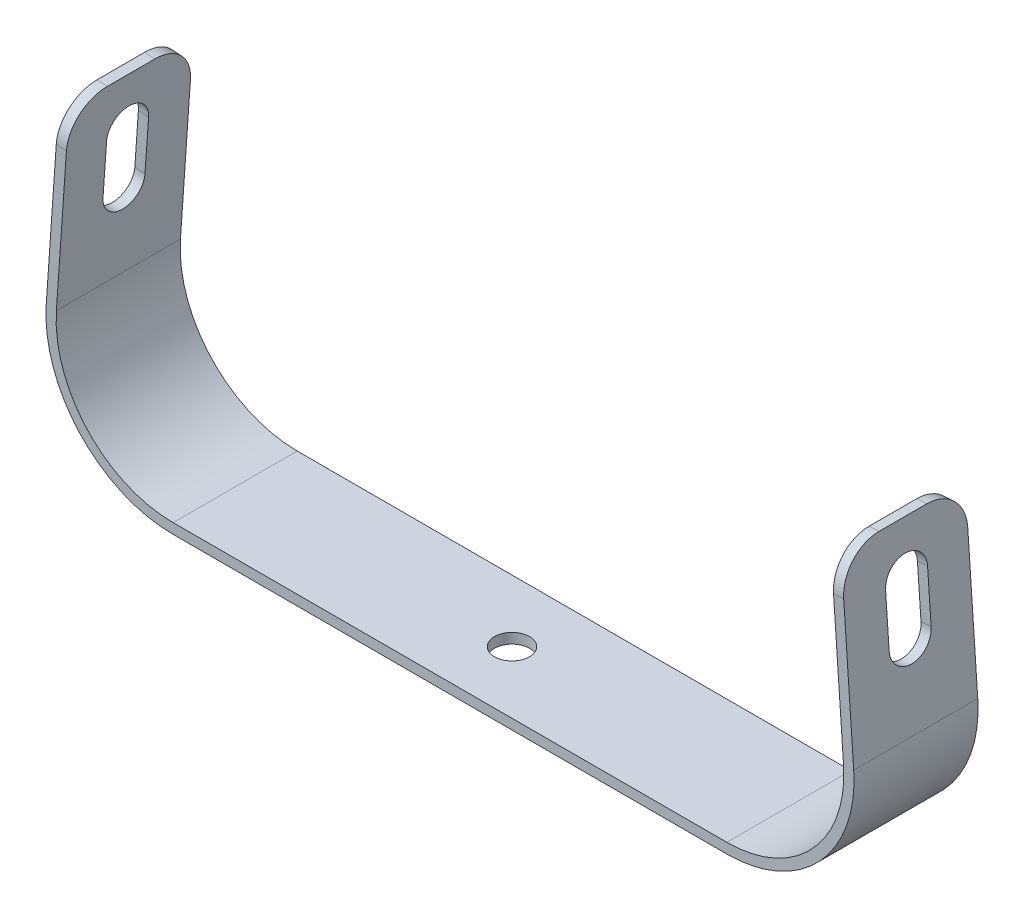
ISO-10303-21;
HEADER;
FILE_DESCRIPTION(('STEP AP214'),'2;1');
FILE_NAME('part.step','',(''),(''),'','','');
FILE_SCHEMA(('AUTOMOTIVE_DESIGN { 1 0 10303 214 1 1 1 1 }'));
ENDSEC;
DATA;
#1=APPLICATION_CONTEXT('core data for automotive mechanical design processes');
#2=APPLICATION_PROTOCOL_DEFINITION('international standard','automotive_design',2000,#1);
#3=PRODUCT_CONTEXT('',#1,'mechanical');
#4=PRODUCT('Part','Part','',(#3));
#5=PRODUCT_RELATED_PRODUCT_CATEGORY('part','',(#4));
#6=PRODUCT_DEFINITION_FORMATION('','',#4);
#7=PRODUCT_DEFINITION_CONTEXT('part definition',#1,'design');
#8=PRODUCT_DEFINITION('design','',#6,#7);
#9=PRODUCT_DEFINITION_SHAPE('','',#8);
#10=(LENGTH_UNIT() NAMED_UNIT(*) SI_UNIT(.MILLI.,.METRE.));
#11=(NAMED_UNIT(*) PLANE_ANGLE_UNIT() SI_UNIT($,.RADIAN.));
#12=(NAMED_UNIT(*) SI_UNIT($,.STERADIAN.) SOLID_ANGLE_UNIT());
#13=UNCERTAINTY_MEASURE_WITH_UNIT(LENGTH_MEASURE(1.E-05),#10,'distance_accuracy_value','');
#14=(GEOMETRIC_REPRESENTATION_CONTEXT(3) GLOBAL_UNCERTAINTY_ASSIGNED_CONTEXT((#13)) GLOBAL_UNIT_ASSIGNED_CONTEXT((#10,
#11,#12)) REPRESENTATION_CONTEXT('',''));
#15=CARTESIAN_POINT('',(0.,0.,0.));
#16=DIRECTION('',(0.,0.,1.));
#17=DIRECTION('',(1.,0.,0.));
#18=AXIS2_PLACEMENT_3D('',#15,#16,#17);
#19=CARTESIAN_POINT('',(452.110985161686,-170.979477552014,-494.449999926082));
#20=DIRECTION('',(0.997564050259824,-0.0697564737441253,0.));
#21=DIRECTION('',(0.0697564737441253,0.997564050259824,0.));
#22=AXIS2_PLACEMENT_3D('',#19,#20,#21);
#23=CYLINDRICAL_SURFACE('',#22,6.);
#24=DIRECTION('',(0.997564050259824,-0.0697564737441253,0.));
#25=VECTOR('',#24,1.);
#26=CARTESIAN_POINT('',(452.110985161686,-170.979477552014,-488.449999926082));
#27=LINE('',#26,#25);
#28=CARTESIAN_POINT('',(414.620123332679,-168.357861107297,-488.449999926082));
#29=VERTEX_POINT('',#28);
#30=CARTESIAN_POINT('',(416.216225813094,-168.469471465288,-488.449999926082));
#31=VERTEX_POINT('',#30);
#32=EDGE_CURVE('E234',#29,#31,#27,.T.);
#33=ORIENTED_EDGE('',*,*,#32,.T.);
#34=CARTESIAN_POINT('',(416.216225813094,-168.469471465287,-494.449999926082));
#35=DIRECTION('',(0.997564050259824,-0.0697564737441253,0.));
#36=DIRECTION('',(0.0697564737441253,0.997564050259824,0.));
#37=AXIS2_PLACEMENT_3D('',#34,#35,#36);
#38=CIRCLE('',#37,6.);
#39=CARTESIAN_POINT('',(416.634764655559,-162.484087163729,-494.449999926082));
#40=VERTEX_POINT('',#39);
#41=EDGE_CURVE('E317',#31,#40,#38,.F.);
#42=ORIENTED_EDGE('',*,*,#41,.T.);
#43=DIRECTION('',(-0.997564050259824,0.0697564737441253,0.));
#44=VECTOR('',#43,1.);
#45=CARTESIAN_POINT('',(416.634764655559,-162.484087163729,-494.449999926082));
#46=LINE('',#45,#44);
#47=CARTESIAN_POINT('',(415.038662175143,-162.372476805738,-494.449999926082));
#48=VERTEX_POINT('',#47);
#49=EDGE_CURVE('E229',#48,#40,#46,.F.);
#50=ORIENTED_EDGE('',*,*,#49,.F.);
#51=CARTESIAN_POINT('',(414.620123332678,-168.357861107297,-494.449999926082));
#52=DIRECTION('',(0.997564050259824,-0.0697564737441253,0.));
#53=DIRECTION('',(0.0697564737441253,0.997564050259824,0.));
#54=AXIS2_PLACEMENT_3D('',#51,#52,#53);
#55=CIRCLE('',#54,6.);
#56=EDGE_CURVE('E302',#29,#48,#55,.F.);
#57=ORIENTED_EDGE('',*,*,#56,.F.);
#58=EDGE_LOOP('',(#33,#42,#50,#57));
#59=FACE_BOUND('',#58,.T.);
#60=ADVANCED_FACE('F17',(#59),#23,.T.);
#61=CARTESIAN_POINT('',(416.634764655559,-162.484087163729,-510.95));
#62=DIRECTION('',(0.0697564737441253,0.997564050259824,0.));
#63=DIRECTION('',(-0.997564050259824,0.0697564737441253,0.));
#64=AXIS2_PLACEMENT_3D('',#61,#62,#63);
#65=PLANE('',#64);
#66=DIRECTION('',(0.997564050259824,-0.0697564737441253,0.));
#67=VECTOR('',#66,1.);
#68=CARTESIAN_POINT('',(452.529524004151,-164.994093250455,-501.95));
#69=LINE('',#68,#67);
#70=CARTESIAN_POINT('',(415.038662175144,-162.372476805738,-501.95));
#71=VERTEX_POINT('',#70);
#72=CARTESIAN_POINT('',(416.634764655559,-162.484087163729,-501.95));
#73=VERTEX_POINT('',#72);
#74=EDGE_CURVE('E226',#71,#73,#69,.T.);
#75=ORIENTED_EDGE('',*,*,#74,.F.);
#76=DIRECTION('',(0.,0.,1.));
#77=VECTOR('',#76,1.);
#78=CARTESIAN_POINT('',(415.038662175144,-162.372476805738,-133.95));
#79=LINE('',#78,#77);
#80=EDGE_CURVE('E301',#48,#71,#79,.F.);
#81=ORIENTED_EDGE('',*,*,#80,.F.);
#82=ORIENTED_EDGE('',*,*,#49,.T.);
#83=DIRECTION('',(0.,0.,1.));
#84=VECTOR('',#83,1.);
#85=CARTESIAN_POINT('',(416.634764655559,-162.484087163729,-133.95));
#86=LINE('',#85,#84);
#87=EDGE_CURVE('E316',#40,#73,#86,.F.);
#88=ORIENTED_EDGE('',*,*,#87,.T.);
#89=EDGE_LOOP('',(#75,#81,#82,#88));
#90=FACE_BOUND('',#89,.T.);
#91=ADVANCED_FACE('F441',(#90),#65,.T.);
#92=CARTESIAN_POINT('',(452.110985161686,-170.979477552014,-501.95));
#93=DIRECTION('',(0.997564050259824,-0.0697564737441253,0.));
#94=DIRECTION('',(0.0697564737441253,0.997564050259824,0.));
#95=AXIS2_PLACEMENT_3D('',#92,#93,#94);
#96=CYLINDRICAL_SURFACE('',#95,6.);
#97=ORIENTED_EDGE('',*,*,#74,.T.);
#98=CARTESIAN_POINT('',(416.216225813094,-168.469471465287,-501.95));
#99=DIRECTION('',(0.997564050259824,-0.0697564737441253,0.));
#100=DIRECTION('',(0.0697564737441253,0.997564050259824,0.));
#101=AXIS2_PLACEMENT_3D('',#98,#99,#100);
#102=CIRCLE('',#101,6.);
#103=CARTESIAN_POINT('',(416.216225813094,-168.469471465288,-507.95));
#104=VERTEX_POINT('',#103);
#105=EDGE_CURVE('E313',#73,#104,#102,.F.);
#106=ORIENTED_EDGE('',*,*,#105,.T.);
#107=DIRECTION('',(0.997564050259824,-0.0697564737441253,0.));
#108=VECTOR('',#107,1.);
#109=CARTESIAN_POINT('',(452.110985161686,-170.979477552015,-507.95));
#110=LINE('',#109,#108);
#111=CARTESIAN_POINT('',(414.620123332679,-168.357861107297,-507.95));
#112=VERTEX_POINT('',#111);
#113=EDGE_CURVE('E227',#104,#112,#110,.F.);
#114=ORIENTED_EDGE('',*,*,#113,.T.);
#115=CARTESIAN_POINT('',(414.620123332679,-168.357861107297,-501.95));
#116=DIRECTION('',(0.997564050259824,-0.0697564737441253,0.));
#117=DIRECTION('',(0.0697564737441253,0.997564050259824,0.));
#118=AXIS2_PLACEMENT_3D('',#115,#116,#117);
#119=CIRCLE('',#118,6.);
#120=EDGE_CURVE('E298',#71,#112,#119,.F.);
#121=ORIENTED_EDGE('',*,*,#120,.F.);
#122=EDGE_LOOP('',(#97,#106,#114,#121));
#123=FACE_BOUND('',#122,.T.);
#124=ADVANCED_FACE('F438',(#123),#96,.T.);
#125=CARTESIAN_POINT('',(413.922558595237,-178.333501609896,-501.499999963041));
#126=DIRECTION('',(0.,0.,1.));
#127=DIRECTION('',(0.,-1.,0.));
#128=AXIS2_PLACEMENT_3D('',#125,#126,#127);
#129=PLANE('',#128);
#130=DIRECTION('',(-0.0697564737441253,-0.997564050259824,0.));
#131=VECTOR('',#130,1.);
#132=CARTESIAN_POINT('',(411.375149748335,-237.700084590764,-501.499999963041));
#133=LINE('',#132,#131);
#134=CARTESIAN_POINT('',(415.518661075653,-178.445111967887,-501.499999963041));
#135=VERTEX_POINT('',#134);
#136=CARTESIAN_POINT('',(416.076712865606,-170.464599565808,-501.499999963041));
#137=VERTEX_POINT('',#136);
#138=EDGE_CURVE('E305',#135,#137,#133,.F.);
#139=ORIENTED_EDGE('',*,*,#138,.T.);
#140=DIRECTION('',(-0.997564050259824,0.0697564737441253,0.));
#141=VECTOR('',#140,1.);
#142=CARTESIAN_POINT('',(414.480610385191,-170.352989207817,-501.499999963041));
#143=LINE('',#142,#141);
#144=CARTESIAN_POINT('',(414.48061038519,-170.352989207817,-501.499999963041));
#145=VERTEX_POINT('',#144);
#146=EDGE_CURVE('E224',#137,#145,#143,.T.);
#147=ORIENTED_EDGE('',*,*,#146,.T.);
#148=DIRECTION('',(-0.0697564737441253,-0.997564050259824,0.));
#149=VECTOR('',#148,1.);
#150=CARTESIAN_POINT('',(409.77904726792,-237.588474232773,-501.499999963041));
#151=LINE('',#150,#149);
#152=CARTESIAN_POINT('',(413.922558595237,-178.333501609896,-501.499999963041));
#153=VERTEX_POINT('',#152);
#154=EDGE_CURVE('E297',#153,#145,#151,.F.);
#155=ORIENTED_EDGE('',*,*,#154,.F.);
#156=DIRECTION('',(-0.997564050259824,0.0697564737441253,0.));
#157=VECTOR('',#156,1.);
#158=CARTESIAN_POINT('',(413.922558595237,-178.333501609896,-501.499999963041));
#159=LINE('',#158,#157);
#160=EDGE_CURVE('E219',#153,#135,#159,.F.);
#161=ORIENTED_EDGE('',*,*,#160,.T.);
#162=EDGE_LOOP('',(#139,#147,#155,#161));
#163=FACE_BOUND('',#162,.T.);
#164=ADVANCED_FACE('F508',(#163),#129,.T.);
#165=CARTESIAN_POINT('',(414.480610385191,-170.352989207817,-498.199999963041));
#166=DIRECTION('',(-0.997564050259824,0.0697564737441253,0.));
#167=DIRECTION('',(-0.0697564737441253,-0.997564050259824,0.));
#168=AXIS2_PLACEMENT_3D('',#165,#166,#167);
#169=CYLINDRICAL_SURFACE('',#168,3.3);
#170=ORIENTED_EDGE('',*,*,#146,.F.);
#171=CARTESIAN_POINT('',(416.076712865606,-170.464599565808,-498.199999963041));
#172=DIRECTION('',(-0.997564050259824,0.0697564737441253,0.));
#173=DIRECTION('',(-0.0697564737441253,-0.997564050259824,0.));
#174=AXIS2_PLACEMENT_3D('',#171,#172,#173);
#175=CIRCLE('',#174,3.3);
#176=CARTESIAN_POINT('',(416.076712865606,-170.464599565808,-494.899999963041));
#177=VERTEX_POINT('',#176);
#178=EDGE_CURVE('E310',#137,#177,#175,.F.);
#179=ORIENTED_EDGE('',*,*,#178,.T.);
#180=DIRECTION('',(0.997564050259809,-0.0697564737443516,0.));
#181=VECTOR('',#180,1.);
#182=CARTESIAN_POINT('',(414.48061038519,-170.352989207817,-494.899999963041));
#183=LINE('',#182,#181);
#184=CARTESIAN_POINT('',(414.48061038519,-170.352989207817,-494.899999963041));
#185=VERTEX_POINT('',#184);
#186=EDGE_CURVE('E221',#185,#177,#183,.T.);
#187=ORIENTED_EDGE('',*,*,#186,.F.);
#188=CARTESIAN_POINT('',(414.48061038519,-170.352989207817,-498.199999963041));
#189=DIRECTION('',(-0.997564050259824,0.0697564737441253,0.));
#190=DIRECTION('',(-0.0697564737441253,-0.997564050259824,0.));
#191=AXIS2_PLACEMENT_3D('',#188,#189,#190);
#192=CIRCLE('',#191,3.3);
#193=EDGE_CURVE('E294',#145,#185,#192,.F.);
#194=ORIENTED_EDGE('',*,*,#193,.F.);
#195=EDGE_LOOP('',(#170,#179,#187,#194));
#196=FACE_BOUND('',#195,.T.);
#197=ADVANCED_FACE('F504',(#196),#169,.F.);
#198=CARTESIAN_POINT('',(414.480610385191,-170.352989207817,-494.899999963041));
#199=DIRECTION('',(0.,0.,-1.));
#200=DIRECTION('',(0.,1.,0.));
#201=AXIS2_PLACEMENT_3D('',#198,#199,#200);
#202=PLANE('',#201);
#203=DIRECTION('',(-0.0697564737441253,-0.997564050259824,0.));
#204=VECTOR('',#203,1.);
#205=CARTESIAN_POINT('',(411.375149748335,-237.700084590764,-494.899999963041));
#206=LINE('',#205,#204);
#207=CARTESIAN_POINT('',(415.518661075653,-178.445111967886,-494.899999963041));
#208=VERTEX_POINT('',#207);
#209=EDGE_CURVE('E309',#177,#208,#206,.T.);
#210=ORIENTED_EDGE('',*,*,#209,.T.);
#211=DIRECTION('',(-0.997564050259824,0.0697564737441253,0.));
#212=VECTOR('',#211,1.);
#213=CARTESIAN_POINT('',(413.922558595237,-178.333501609895,-494.899999963041));
#214=LINE('',#213,#212);
#215=CARTESIAN_POINT('',(413.922558595237,-178.333501609896,-494.899999963041));
#216=VERTEX_POINT('',#215);
#217=EDGE_CURVE('E194',#208,#216,#214,.T.);
#218=ORIENTED_EDGE('',*,*,#217,.T.);
#219=DIRECTION('',(-0.0697564737441253,-0.997564050259824,0.));
#220=VECTOR('',#219,1.);
#221=CARTESIAN_POINT('',(409.77904726792,-237.588474232773,-494.899999963041));
#222=LINE('',#221,#220);
#223=EDGE_CURVE('E293',#185,#216,#222,.T.);
#224=ORIENTED_EDGE('',*,*,#223,.F.);
#225=ORIENTED_EDGE('',*,*,#186,.T.);
#226=EDGE_LOOP('',(#210,#218,#224,#225));
#227=FACE_BOUND('',#226,.T.);
#228=ADVANCED_FACE('F500',(#227),#202,.T.);
#229=CARTESIAN_POINT('',(413.922558595237,-178.333501609896,-498.199999963041));
#230=DIRECTION('',(-0.997564050259824,0.0697564737441253,0.));
#231=DIRECTION('',(-0.0697564737441253,-0.997564050259824,0.));
#232=AXIS2_PLACEMENT_3D('',#229,#230,#231);
#233=CYLINDRICAL_SURFACE('',#232,3.3);
#234=ORIENTED_EDGE('',*,*,#217,.F.);
#235=CARTESIAN_POINT('',(415.518661075653,-178.445111967887,-498.199999963041));
#236=DIRECTION('',(-0.997564050259824,0.0697564737441253,0.));
#237=DIRECTION('',(-0.0697564737441253,-0.997564050259824,0.));
#238=AXIS2_PLACEMENT_3D('',#235,#236,#237);
#239=CIRCLE('',#238,3.3);
#240=EDGE_CURVE('E306',#208,#135,#239,.F.);
#241=ORIENTED_EDGE('',*,*,#240,.T.);
#242=ORIENTED_EDGE('',*,*,#160,.F.);
#243=CARTESIAN_POINT('',(413.922558595237,-178.333501609896,-498.199999963041));
#244=DIRECTION('',(-0.997564050259824,0.0697564737441253,0.));
#245=DIRECTION('',(-0.0697564737441253,-0.997564050259824,0.));
#246=AXIS2_PLACEMENT_3D('',#243,#244,#245);
#247=CIRCLE('',#246,3.3);
#248=EDGE_CURVE('E290',#216,#153,#247,.F.);
#249=ORIENTED_EDGE('',*,*,#248,.F.);
#250=EDGE_LOOP('',(#234,#241,#242,#249));
#251=FACE_BOUND('',#250,.T.);
#252=ADVANCED_FACE('F497',(#251),#233,.F.);
#253=CARTESIAN_POINT('',(538.540694391833,-170.352989207817,-498.199999963041));
#254=DIRECTION('',(0.997564050259824,0.0697564737441253,0.));
#255=DIRECTION('',(-0.0697564737441253,0.997564050259824,0.));
#256=AXIS2_PLACEMENT_3D('',#253,#254,#255);
#257=CYLINDRICAL_SURFACE('',#256,3.3);
#258=DIRECTION('',(0.997564050259809,0.0697564737443516,0.));
#259=VECTOR('',#258,1.);
#260=CARTESIAN_POINT('',(536.944591911417,-170.464599565808,-494.899999963041));
#261=LINE('',#260,#259);
#262=CARTESIAN_POINT('',(536.944591911417,-170.464599565808,-494.899999963041));
#263=VERTEX_POINT('',#262);
#264=CARTESIAN_POINT('',(538.540694391833,-170.352989207817,-494.899999963041));
#265=VERTEX_POINT('',#264);
#266=EDGE_CURVE('E175',#263,#265,#261,.T.);
#267=ORIENTED_EDGE('',*,*,#266,.F.);
#268=CARTESIAN_POINT('',(536.944591911417,-170.464599565808,-498.199999963041));
#269=DIRECTION('',(0.997564050259824,0.0697564737441253,0.));
#270=DIRECTION('',(-0.0697564737441253,0.997564050259824,0.));
#271=AXIS2_PLACEMENT_3D('',#268,#269,#270);
#272=CIRCLE('',#271,3.3);
#273=CARTESIAN_POINT('',(536.944591911417,-170.464599565808,-501.499999963041));
#274=VERTEX_POINT('',#273);
#275=EDGE_CURVE('E20',#263,#274,#272,.F.);
#276=ORIENTED_EDGE('',*,*,#275,.T.);
#277=DIRECTION('',(-0.997564050259809,-0.0697564737443516,0.));
#278=VECTOR('',#277,1.);
#279=CARTESIAN_POINT('',(538.540694391833,-170.352989207817,-501.499999963041));
#280=LINE('',#279,#278);
#281=CARTESIAN_POINT('',(538.540694391833,-170.352989207817,-501.499999963041));
#282=VERTEX_POINT('',#281);
#283=EDGE_CURVE('E180',#282,#274,#280,.T.);
#284=ORIENTED_EDGE('',*,*,#283,.F.);
#285=CARTESIAN_POINT('',(538.540694391833,-170.352989207817,-498.199999963041));
#286=DIRECTION('',(0.997564050259824,0.0697564737441253,0.));
#287=DIRECTION('',(-0.0697564737441253,0.997564050259824,0.));
#288=AXIS2_PLACEMENT_3D('',#285,#286,#287);
#289=CIRCLE('',#288,3.3);
#290=EDGE_CURVE('E288',#265,#282,#289,.F.);
#291=ORIENTED_EDGE('',*,*,#290,.F.);
#292=EDGE_LOOP('',(#267,#276,#284,#291));
#293=FACE_BOUND('',#292,.T.);
#294=ADVANCED_FACE('F179',(#293),#257,.F.);
#295=CARTESIAN_POINT('',(538.540694391833,-170.352989207817,-501.499999963041));
#296=DIRECTION('',(0.,0.,1.));
#297=DIRECTION('',(1.,0.,0.));
#298=AXIS2_PLACEMENT_3D('',#295,#296,#297);
#299=PLANE('',#298);
#300=DIRECTION('',(-0.0697564737441253,0.997564050259824,0.));
#301=VECTOR('',#300,1.);
#302=CARTESIAN_POINT('',(545.651051633401,-294.972774327403,-501.499999963041));
#303=LINE('',#302,#301);
#304=CARTESIAN_POINT('',(537.50264370137,-178.445111967886,-501.499999963041));
#305=VERTEX_POINT('',#304);
#306=EDGE_CURVE('E185',#274,#305,#303,.F.);
#307=ORIENTED_EDGE('',*,*,#306,.T.);
#308=DIRECTION('',(0.997564050259824,0.0697564737441253,0.));
#309=VECTOR('',#308,1.);
#310=CARTESIAN_POINT('',(539.098746181786,-178.333501609895,-501.499999963041));
#311=LINE('',#310,#309);
#312=CARTESIAN_POINT('',(539.098746181786,-178.333501609896,-501.499999963041));
#313=VERTEX_POINT('',#312);
#314=EDGE_CURVE('E193',#305,#313,#311,.T.);
#315=ORIENTED_EDGE('',*,*,#314,.T.);
#316=DIRECTION('',(-0.0697564737441253,0.997564050259824,0.));
#317=VECTOR('',#316,1.);
#318=CARTESIAN_POINT('',(547.247154113816,-294.861163969412,-501.499999963041));
#319=LINE('',#318,#317);
#320=EDGE_CURVE('E191',#282,#313,#319,.F.);
#321=ORIENTED_EDGE('',*,*,#320,.F.);
#322=ORIENTED_EDGE('',*,*,#283,.T.);
#323=EDGE_LOOP('',(#307,#315,#321,#322));
#324=FACE_BOUND('',#323,.T.);
#325=ADVANCED_FACE('F188',(#324),#299,.T.);
#326=CARTESIAN_POINT('',(539.098746181786,-178.333501609896,-498.199999963041));
#327=DIRECTION('',(0.997564050259824,0.0697564737441253,0.));
#328=DIRECTION('',(-0.0697564737441253,0.997564050259824,0.));
#329=AXIS2_PLACEMENT_3D('',#326,#327,#328);
#330=CYLINDRICAL_SURFACE('',#329,3.3);
#331=ORIENTED_EDGE('',*,*,#314,.F.);
#332=CARTESIAN_POINT('',(537.50264370137,-178.445111967887,-498.199999963041));
#333=DIRECTION('',(0.997564050259824,0.0697564737441253,0.));
#334=DIRECTION('',(-0.0697564737441253,0.997564050259824,0.));
#335=AXIS2_PLACEMENT_3D('',#332,#333,#334);
#336=CIRCLE('',#335,3.3);
#337=CARTESIAN_POINT('',(537.50264370137,-178.445111967886,-494.899999963041));
#338=VERTEX_POINT('',#337);
#339=EDGE_CURVE('E198',#305,#338,#336,.F.);
#340=ORIENTED_EDGE('',*,*,#339,.T.);
#341=DIRECTION('',(-0.997564050259853,-0.0697564737437205,0.));
#342=VECTOR('',#341,1.);
#343=CARTESIAN_POINT('',(539.098746181786,-178.333501609896,-494.899999963041));
#344=LINE('',#343,#342);
#345=CARTESIAN_POINT('',(539.098746181786,-178.333501609896,-494.899999963041));
#346=VERTEX_POINT('',#345);
#347=EDGE_CURVE('E213',#346,#338,#344,.T.);
#348=ORIENTED_EDGE('',*,*,#347,.F.);
#349=CARTESIAN_POINT('',(539.098746181786,-178.333501609896,-498.199999963041));
#350=DIRECTION('',(0.997564050259824,0.0697564737441253,0.));
#351=DIRECTION('',(-0.0697564737441253,0.997564050259824,0.));
#352=AXIS2_PLACEMENT_3D('',#349,#350,#351);
#353=CIRCLE('',#352,3.3);
#354=EDGE_CURVE('E285',#313,#346,#353,.F.);
#355=ORIENTED_EDGE('',*,*,#354,.F.);
#356=EDGE_LOOP('',(#331,#340,#348,#355));
#357=FACE_BOUND('',#356,.T.);
#358=ADVANCED_FACE('F334',(#357),#330,.F.);
#359=CARTESIAN_POINT('',(539.16850265553,-179.331065660155,-494.899999963041));
#360=DIRECTION('',(0.,0.,-1.));
#361=DIRECTION('',(-1.,0.,0.));
#362=AXIS2_PLACEMENT_3D('',#359,#360,#361);
#363=PLANE('',#362);
#364=DIRECTION('',(-0.0697564737441253,0.997564050259824,0.));
#365=VECTOR('',#364,1.);
#366=CARTESIAN_POINT('',(545.651051633401,-294.972774327403,-494.899999963041));
#367=LINE('',#366,#365);
#368=EDGE_CURVE('E200',#338,#263,#367,.T.);
#369=ORIENTED_EDGE('',*,*,#368,.T.);
#370=ORIENTED_EDGE('',*,*,#266,.T.);
#371=DIRECTION('',(-0.0697564737441253,0.997564050259824,0.));
#372=VECTOR('',#371,1.);
#373=CARTESIAN_POINT('',(547.247154113816,-294.861163969412,-494.899999963041));
#374=LINE('',#373,#372);
#375=EDGE_CURVE('E284',#346,#265,#374,.T.);
#376=ORIENTED_EDGE('',*,*,#375,.F.);
#377=ORIENTED_EDGE('',*,*,#347,.T.);
#378=EDGE_LOOP('',(#369,#370,#376,#377));
#379=FACE_BOUND('',#378,.T.);
#380=ADVANCED_FACE('F329',(#379),#363,.T.);
#381=CARTESIAN_POINT('',(452.110985161686,-174.391859435323,-501.95));
#382=DIRECTION('',(-0.997564050259824,-0.0697564737441253,0.));
#383=DIRECTION('',(0.0697564737441253,-0.997564050259824,0.));
#384=AXIS2_PLACEMENT_3D('',#381,#382,#383);
#385=CYLINDRICAL_SURFACE('',#384,6.);
#386=DIRECTION('',(-0.997564050259824,-0.0697564737441253,0.));
#387=VECTOR('',#386,1.);
#388=CARTESIAN_POINT('',(452.110985161686,-174.391859435323,-507.95));
#389=LINE('',#388,#387);
#390=CARTESIAN_POINT('',(538.401181444344,-168.357861107297,-507.95));
#391=VERTEX_POINT('',#390);
#392=CARTESIAN_POINT('',(536.805078963929,-168.469471465288,-507.95));
#393=VERTEX_POINT('',#392);
#394=EDGE_CURVE('E211',#391,#393,#389,.T.);
#395=ORIENTED_EDGE('',*,*,#394,.T.);
#396=CARTESIAN_POINT('',(536.805078963929,-168.469471465288,-501.95));
#397=DIRECTION('',(-0.997564050259824,-0.0697564737441253,0.));
#398=DIRECTION('',(0.0697564737441253,-0.997564050259824,0.));
#399=AXIS2_PLACEMENT_3D('',#396,#397,#398);
#400=CIRCLE('',#399,6.);
#401=CARTESIAN_POINT('',(536.386540121464,-162.484087163729,-501.95));
#402=VERTEX_POINT('',#401);
#403=EDGE_CURVE('E325',#393,#402,#400,.F.);
#404=ORIENTED_EDGE('',*,*,#403,.T.);
#405=DIRECTION('',(-0.997564050259824,-0.0697564737441253,0.));
#406=VECTOR('',#405,1.);
#407=CARTESIAN_POINT('',(536.386540121464,-162.484087163729,-501.95));
#408=LINE('',#407,#406);
#409=CARTESIAN_POINT('',(537.98264260188,-162.372476805738,-501.95));
#410=VERTEX_POINT('',#409);
#411=EDGE_CURVE('E206',#410,#402,#408,.T.);
#412=ORIENTED_EDGE('',*,*,#411,.F.);
#413=CARTESIAN_POINT('',(538.401181444345,-168.357861107297,-501.95));
#414=DIRECTION('',(-0.997564050259824,-0.0697564737441253,0.));
#415=DIRECTION('',(0.0697564737441253,-0.997564050259824,0.));
#416=AXIS2_PLACEMENT_3D('',#413,#414,#415);
#417=CIRCLE('',#416,6.);
#418=EDGE_CURVE('E281',#391,#410,#417,.F.);
#419=ORIENTED_EDGE('',*,*,#418,.F.);
#420=EDGE_LOOP('',(#395,#404,#412,#419));
#421=FACE_BOUND('',#420,.T.);
#422=ADVANCED_FACE('F486',(#421),#385,.T.);
#423=CARTESIAN_POINT('',(536.386540121464,-162.484087163729,243.05));
#424=DIRECTION('',(-0.0697564737441253,0.997564050259824,0.));
#425=DIRECTION('',(-0.997564050259824,-0.0697564737441253,0.));
#426=AXIS2_PLACEMENT_3D('',#423,#424,#425);
#427=PLANE('',#426);
#428=DIRECTION('',(-0.997564050259824,-0.0697564737441253,0.));
#429=VECTOR('',#428,1.);
#430=CARTESIAN_POINT('',(451.692446319221,-168.406475133764,-494.449999926082));
#431=LINE('',#430,#429);
#432=CARTESIAN_POINT('',(537.982642601879,-162.372476805738,-494.449999926082));
#433=VERTEX_POINT('',#432);
#434=CARTESIAN_POINT('',(536.386540121464,-162.484087163729,-494.449999926082));
#435=VERTEX_POINT('',#434);
#436=EDGE_CURVE('E186',#433,#435,#431,.T.);
#437=ORIENTED_EDGE('',*,*,#436,.F.);
#438=DIRECTION('',(0.,0.,1.));
#439=VECTOR('',#438,1.);
#440=CARTESIAN_POINT('',(537.982642601879,-162.372476805738,-133.95));
#441=LINE('',#440,#439);
#442=EDGE_CURVE('E280',#410,#433,#441,.T.);
#443=ORIENTED_EDGE('',*,*,#442,.F.);
#444=ORIENTED_EDGE('',*,*,#411,.T.);
#445=DIRECTION('',(0.,0.,1.));
#446=VECTOR('',#445,1.);
#447=CARTESIAN_POINT('',(536.386540121464,-162.484087163729,-133.95));
#448=LINE('',#447,#446);
#449=EDGE_CURVE('E324',#402,#435,#448,.T.);
#450=ORIENTED_EDGE('',*,*,#449,.T.);
#451=EDGE_LOOP('',(#437,#443,#444,#450));
#452=FACE_BOUND('',#451,.T.);
#453=ADVANCED_FACE('F399',(#452),#427,.T.);
#454=CARTESIAN_POINT('',(452.110985161686,-174.391859435323,-494.449999926082));
#455=DIRECTION('',(-0.997564050259824,-0.0697564737441253,0.));
#456=DIRECTION('',(0.0697564737441253,-0.997564050259824,0.));
#457=AXIS2_PLACEMENT_3D('',#454,#455,#456);
#458=CYLINDRICAL_SURFACE('',#457,6.);
#459=ORIENTED_EDGE('',*,*,#436,.T.);
#460=CARTESIAN_POINT('',(536.805078963929,-168.469471465288,-494.449999926082));
#461=DIRECTION('',(-0.997564050259824,-0.0697564737441253,0.));
#462=DIRECTION('',(0.0697564737441253,-0.997564050259824,0.));
#463=AXIS2_PLACEMENT_3D('',#460,#461,#462);
#464=CIRCLE('',#463,6.);
#465=CARTESIAN_POINT('',(536.805078963929,-168.469471465288,-488.449999926082));
#466=VERTEX_POINT('',#465);
#467=EDGE_CURVE('E320',#435,#466,#464,.F.);
#468=ORIENTED_EDGE('',*,*,#467,.T.);
#469=DIRECTION('',(-0.997564050259824,-0.0697564737441253,0.));
#470=VECTOR('',#469,1.);
#471=CARTESIAN_POINT('',(452.110985161686,-174.391859435323,-488.449999926082));
#472=LINE('',#471,#470);
#473=CARTESIAN_POINT('',(538.401181444344,-168.357861107297,-488.449999926082));
#474=VERTEX_POINT('',#473);
#475=EDGE_CURVE('E204',#466,#474,#472,.F.);
#476=ORIENTED_EDGE('',*,*,#475,.T.);
#477=CARTESIAN_POINT('',(538.401181444344,-168.357861107297,-494.449999926082));
#478=DIRECTION('',(-0.997564050259824,-0.0697564737441253,0.));
#479=DIRECTION('',(0.0697564737441253,-0.997564050259824,0.));
#480=AXIS2_PLACEMENT_3D('',#477,#478,#479);
#481=CIRCLE('',#480,6.);
#482=EDGE_CURVE('E277',#433,#474,#481,.F.);
#483=ORIENTED_EDGE('',*,*,#482,.F.);
#484=EDGE_LOOP('',(#459,#468,#476,#483));
#485=FACE_BOUND('',#484,.T.);
#486=ADVANCED_FACE('F402',(#485),#458,.T.);
#487=CARTESIAN_POINT('',(545.651051633401,-294.972774327403,-133.95));
#488=DIRECTION('',(0.997564050259824,0.0697564737441253,0.));
#489=DIRECTION('',(-0.0697564737441253,0.997564050259824,0.));
#490=AXIS2_PLACEMENT_3D('',#487,#488,#489);
#491=PLANE('',#490);
#492=DIRECTION('',(0.069756473744121,-0.997564050259825,0.));
#493=VECTOR('',#492,1.);
#494=CARTESIAN_POINT('',(536.805078963929,-168.469471465288,-488.449999926082));
#495=LINE('',#494,#493);
#496=CARTESIAN_POINT('',(538.380955302983,-191.005553051951,-488.449999926082));
#497=VERTEX_POINT('',#496);
#498=EDGE_CURVE('E254',#466,#497,#495,.T.);
#499=ORIENTED_EDGE('',*,*,#498,.F.);
#500=ORIENTED_EDGE('',*,*,#467,.F.);
#501=ORIENTED_EDGE('',*,*,#449,.F.);
#502=ORIENTED_EDGE('',*,*,#403,.F.);
#503=DIRECTION('',(-0.069756473744121,0.997564050259825,0.));
#504=VECTOR('',#503,1.);
#505=CARTESIAN_POINT('',(538.380955302983,-191.005553051951,-507.95));
#506=LINE('',#505,#504);
#507=CARTESIAN_POINT('',(538.380955302983,-191.005553051951,-507.95));
#508=VERTEX_POINT('',#507);
#509=EDGE_CURVE('E267',#508,#393,#506,.T.);
#510=ORIENTED_EDGE('',*,*,#509,.F.);
#511=DIRECTION('',(0.,0.,-1.));
#512=VECTOR('',#511,1.);
#513=CARTESIAN_POINT('',(538.380955302983,-191.005553051951,-133.95));
#514=LINE('',#513,#512);
#515=EDGE_CURVE('E323',#508,#497,#514,.F.);
#516=ORIENTED_EDGE('',*,*,#515,.T.);
#517=EDGE_LOOP('',(#499,#500,#501,#502,#510,#516));
#518=FACE_BOUND('',#517,.T.);
#519=ORIENTED_EDGE('',*,*,#339,.F.);
#520=ORIENTED_EDGE('',*,*,#306,.F.);
#521=ORIENTED_EDGE('',*,*,#275,.F.);
#522=ORIENTED_EDGE('',*,*,#368,.F.);
#523=EDGE_LOOP('',(#519,#520,#521,#522));
#524=FACE_BOUND('',#523,.T.);
#525=ADVANCED_FACE('F197',(#518,#524),#491,.F.);
#526=CARTESIAN_POINT('',(520.025776778202,-192.289072168843,-133.95));
#527=DIRECTION('',(0.,0.,-1.));
#528=DIRECTION('',(-1.,0.,0.));
#529=AXIS2_PLACEMENT_3D('',#526,#527,#528);
#530=CYLINDRICAL_SURFACE('',#529,18.4);
#531=CARTESIAN_POINT('',(520.025776778202,-192.289072168843,-507.95));
#532=DIRECTION('',(0.,0.,-1.));
#533=DIRECTION('',(-1.,0.,0.));
#534=AXIS2_PLACEMENT_3D('',#531,#532,#533);
#535=CIRCLE('',#534,18.4);
#536=CARTESIAN_POINT('',(520.025776778202,-210.689072168843,-507.95));
#537=VERTEX_POINT('',#536);
#538=EDGE_CURVE('E264',#537,#508,#535,.F.);
#539=ORIENTED_EDGE('',*,*,#538,.F.);
#540=DIRECTION('',(0.,0.,-1.));
#541=VECTOR('',#540,1.);
#542=CARTESIAN_POINT('',(520.025776778202,-210.689072168843,-133.95));
#543=LINE('',#542,#541);
#544=CARTESIAN_POINT('',(520.025776778202,-210.689072168843,-488.449999926082));
#545=VERTEX_POINT('',#544);
#546=EDGE_CURVE('E355',#537,#545,#543,.F.);
#547=ORIENTED_EDGE('',*,*,#546,.T.);
#548=CARTESIAN_POINT('',(520.025776778202,-192.289072168843,-488.449999926082));
#549=DIRECTION('',(0.,0.,-1.));
#550=DIRECTION('',(-1.,0.,0.));
#551=AXIS2_PLACEMENT_3D('',#548,#549,#550);
#552=CIRCLE('',#551,18.4);
#553=EDGE_CURVE('E251',#497,#545,#552,.T.);
#554=ORIENTED_EDGE('',*,*,#553,.F.);
#555=ORIENTED_EDGE('',*,*,#515,.F.);
#556=EDGE_LOOP('',(#539,#547,#554,#555));
#557=FACE_BOUND('',#556,.T.);
#558=ADVANCED_FACE('F366',(#557),#530,.F.);
#559=CARTESIAN_POINT('',(447.804380484607,-210.689072168843,-133.95));
#560=DIRECTION('',(0.,-1.,0.));
#561=DIRECTION('',(0.,0.,-1.));
#562=AXIS2_PLACEMENT_3D('',#559,#560,#561);
#563=PLANE('',#562);
#564=DIRECTION('',(1.,0.,0.));
#565=VECTOR('',#564,1.);
#566=CARTESIAN_POINT('',(415.200392526002,-210.689072168843,-488.449999926082));
#567=LINE('',#566,#565);
#568=CARTESIAN_POINT('',(432.995527998821,-210.689072168843,-488.449999926082));
#569=VERTEX_POINT('',#568);
#570=EDGE_CURVE('E250',#545,#569,#567,.F.);
#571=ORIENTED_EDGE('',*,*,#570,.F.);
#572=ORIENTED_EDGE('',*,*,#546,.F.);
#573=DIRECTION('',(-1.,0.,0.));
#574=VECTOR('',#573,1.);
#575=CARTESIAN_POINT('',(542.79405339825,-210.689072168843,-507.95));
#576=LINE('',#575,#574);
#577=CARTESIAN_POINT('',(432.995527998821,-210.689072168843,-507.95));
#578=VERTEX_POINT('',#577);
#579=EDGE_CURVE('E268',#578,#537,#576,.F.);
#580=ORIENTED_EDGE('',*,*,#579,.F.);
#581=DIRECTION('',(0.,0.,-1.));
#582=VECTOR('',#581,1.);
#583=CARTESIAN_POINT('',(432.995527998821,-210.689072168843,-133.95));
#584=LINE('',#583,#582);
#585=EDGE_CURVE('E319',#578,#569,#584,.F.);
#586=ORIENTED_EDGE('',*,*,#585,.T.);
#587=EDGE_LOOP('',(#571,#572,#580,#586));
#588=FACE_BOUND('',#587,.T.);
#589=CARTESIAN_POINT('',(476.510652388512,-210.689072168843,-498.199999963041));
#590=DIRECTION('',(0.,-1.,0.));
#591=DIRECTION('',(0.,0.,-1.));
#592=AXIS2_PLACEMENT_3D('',#589,#590,#591);
#593=CIRCLE('',#592,2.75);
#594=CARTESIAN_POINT('',(476.510652388512,-210.689072168843,-500.949999963041));
#595=VERTEX_POINT('',#594);
#596=EDGE_CURVE('E273',#595,#595,#593,.T.);
#597=ORIENTED_EDGE('',*,*,#596,.T.);
#598=EDGE_LOOP('',(#597));
#599=FACE_BOUND('',#598,.T.);
#600=ADVANCED_FACE('F408',(#588,#599),#563,.F.);
#601=CARTESIAN_POINT('',(432.995527998821,-192.289072168843,-133.95));
#602=DIRECTION('',(0.,0.,-1.));
#603=DIRECTION('',(-1.,0.,0.));
#604=AXIS2_PLACEMENT_3D('',#601,#602,#603);
#605=CYLINDRICAL_SURFACE('',#604,18.4);
#606=CARTESIAN_POINT('',(432.995527998821,-192.289072168843,-507.95));
#607=DIRECTION('',(0.,0.,-1.));
#608=DIRECTION('',(-1.,0.,0.));
#609=AXIS2_PLACEMENT_3D('',#606,#607,#608);
#610=CIRCLE('',#609,18.4);
#611=CARTESIAN_POINT('',(414.64034947404,-191.005553051951,-507.95));
#612=VERTEX_POINT('',#611);
#613=EDGE_CURVE('E269',#612,#578,#610,.F.);
#614=ORIENTED_EDGE('',*,*,#613,.F.);
#615=DIRECTION('',(0.,0.,1.));
#616=VECTOR('',#615,1.);
#617=CARTESIAN_POINT('',(414.64034947404,-191.005553051951,-133.95));
#618=LINE('',#617,#616);
#619=CARTESIAN_POINT('',(414.64034947404,-191.005553051951,-488.449999926082));
#620=VERTEX_POINT('',#619);
#621=EDGE_CURVE('E312',#612,#620,#618,.T.);
#622=ORIENTED_EDGE('',*,*,#621,.T.);
#623=CARTESIAN_POINT('',(432.995527998821,-192.289072168843,-488.449999926082));
#624=DIRECTION('',(0.,0.,-1.));
#625=DIRECTION('',(-1.,0.,0.));
#626=AXIS2_PLACEMENT_3D('',#623,#624,#625);
#627=CIRCLE('',#626,18.4);
#628=EDGE_CURVE('E246',#569,#620,#627,.T.);
#629=ORIENTED_EDGE('',*,*,#628,.F.);
#630=ORIENTED_EDGE('',*,*,#585,.F.);
#631=EDGE_LOOP('',(#614,#622,#629,#630));
#632=FACE_BOUND('',#631,.T.);
#633=ADVANCED_FACE('F414',(#632),#605,.F.);
#634=CARTESIAN_POINT('',(411.375149748335,-237.700084590764,-133.95));
#635=DIRECTION('',(-0.997564050259824,0.0697564737441253,0.));
#636=DIRECTION('',(-0.0697564737441253,-0.997564050259824,0.));
#637=AXIS2_PLACEMENT_3D('',#634,#635,#636);
#638=PLANE('',#637);
#639=ORIENTED_EDGE('',*,*,#240,.F.);
#640=ORIENTED_EDGE('',*,*,#209,.F.);
#641=ORIENTED_EDGE('',*,*,#178,.F.);
#642=ORIENTED_EDGE('',*,*,#138,.F.);
#643=EDGE_LOOP('',(#639,#640,#641,#642));
#644=FACE_BOUND('',#643,.T.);
#645=DIRECTION('',(-0.0697564737441161,-0.997564050259825,0.));
#646=VECTOR('',#645,1.);
#647=CARTESIAN_POINT('',(416.216225813094,-168.469471465288,-507.95));
#648=LINE('',#647,#646);
#649=EDGE_CURVE('E272',#104,#612,#648,.T.);
#650=ORIENTED_EDGE('',*,*,#649,.F.);
#651=ORIENTED_EDGE('',*,*,#105,.F.);
#652=ORIENTED_EDGE('',*,*,#87,.F.);
#653=ORIENTED_EDGE('',*,*,#41,.F.);
#654=DIRECTION('',(0.0697564737441161,0.997564050259825,0.));
#655=VECTOR('',#654,1.);
#656=CARTESIAN_POINT('',(414.64034947404,-191.005553051951,-488.449999926082));
#657=LINE('',#656,#655);
#658=EDGE_CURVE('E249',#620,#31,#657,.T.);
#659=ORIENTED_EDGE('',*,*,#658,.F.);
#660=ORIENTED_EDGE('',*,*,#621,.F.);
#661=EDGE_LOOP('',(#650,#651,#652,#653,#659,#660));
#662=FACE_BOUND('',#661,.T.);
#663=ADVANCED_FACE('F418',(#644,#662),#638,.F.);
#664=CARTESIAN_POINT('',(409.77904726792,-237.588474232773,-133.95));
#665=DIRECTION('',(-0.997564050259824,0.0697564737441253,0.));
#666=DIRECTION('',(-0.0697564737441253,-0.997564050259824,0.));
#667=AXIS2_PLACEMENT_3D('',#664,#665,#666);
#668=PLANE('',#667);
#669=ORIENTED_EDGE('',*,*,#223,.T.);
#670=ORIENTED_EDGE('',*,*,#248,.T.);
#671=ORIENTED_EDGE('',*,*,#154,.T.);
#672=ORIENTED_EDGE('',*,*,#193,.T.);
#673=EDGE_LOOP('',(#669,#670,#671,#672));
#674=FACE_BOUND('',#673,.T.);
#675=ORIENTED_EDGE('',*,*,#120,.T.);
#676=DIRECTION('',(0.0697564737441161,0.997564050259825,0.));
#677=VECTOR('',#676,1.);
#678=CARTESIAN_POINT('',(413.044246993625,-190.89394269396,-507.95));
#679=LINE('',#678,#677);
#680=CARTESIAN_POINT('',(413.044246993625,-190.89394269396,-507.95));
#681=VERTEX_POINT('',#680);
#682=EDGE_CURVE('E262',#681,#112,#679,.T.);
#683=ORIENTED_EDGE('',*,*,#682,.F.);
#684=DIRECTION('',(0.,0.,-1.));
#685=VECTOR('',#684,1.);
#686=CARTESIAN_POINT('',(413.044246993625,-190.89394269396,-133.95));
#687=LINE('',#686,#685);
#688=CARTESIAN_POINT('',(413.044246993625,-190.89394269396,-488.449999926082));
#689=VERTEX_POINT('',#688);
#690=EDGE_CURVE('E276',#689,#681,#687,.T.);
#691=ORIENTED_EDGE('',*,*,#690,.F.);
#692=DIRECTION('',(-0.0697564737441161,-0.997564050259825,0.));
#693=VECTOR('',#692,1.);
#694=CARTESIAN_POINT('',(414.620123332679,-168.357861107297,-488.449999926082));
#695=LINE('',#694,#693);
#696=EDGE_CURVE('E245',#29,#689,#695,.T.);
#697=ORIENTED_EDGE('',*,*,#696,.F.);
#698=ORIENTED_EDGE('',*,*,#56,.T.);
#699=ORIENTED_EDGE('',*,*,#80,.T.);
#700=EDGE_LOOP('',(#675,#683,#691,#697,#698,#699));
#701=FACE_BOUND('',#700,.T.);
#702=ADVANCED_FACE('F434',(#674,#701),#668,.T.);
#703=CARTESIAN_POINT('',(547.247154113816,-294.861163969412,-133.95));
#704=DIRECTION('',(0.997564050259824,0.0697564737441253,0.));
#705=DIRECTION('',(-0.0697564737441253,0.997564050259824,0.));
#706=AXIS2_PLACEMENT_3D('',#703,#704,#705);
#707=PLANE('',#706);
#708=ORIENTED_EDGE('',*,*,#482,.T.);
#709=DIRECTION('',(-0.0697564737441601,0.997564050259822,0.));
#710=VECTOR('',#709,1.);
#711=CARTESIAN_POINT('',(539.977057783399,-190.89394269396,-488.449999926082));
#712=LINE('',#711,#710);
#713=CARTESIAN_POINT('',(539.977057783399,-190.89394269396,-488.449999926082));
#714=VERTEX_POINT('',#713);
#715=EDGE_CURVE('E240',#714,#474,#712,.T.);
#716=ORIENTED_EDGE('',*,*,#715,.F.);
#717=DIRECTION('',(0.,0.,-1.));
#718=VECTOR('',#717,1.);
#719=CARTESIAN_POINT('',(539.977057783399,-190.89394269396,-133.95));
#720=LINE('',#719,#718);
#721=CARTESIAN_POINT('',(539.977057783399,-190.89394269396,-507.95));
#722=VERTEX_POINT('',#721);
#723=EDGE_CURVE('E258',#722,#714,#720,.F.);
#724=ORIENTED_EDGE('',*,*,#723,.F.);
#725=DIRECTION('',(0.0697564737441601,-0.997564050259822,0.));
#726=VECTOR('',#725,1.);
#727=CARTESIAN_POINT('',(538.401181444344,-168.357861107297,-507.95));
#728=LINE('',#727,#726);
#729=EDGE_CURVE('E263',#391,#722,#728,.T.);
#730=ORIENTED_EDGE('',*,*,#729,.F.);
#731=ORIENTED_EDGE('',*,*,#418,.T.);
#732=ORIENTED_EDGE('',*,*,#442,.T.);
#733=EDGE_LOOP('',(#708,#716,#724,#730,#731,#732));
#734=FACE_BOUND('',#733,.T.);
#735=ORIENTED_EDGE('',*,*,#354,.T.);
#736=ORIENTED_EDGE('',*,*,#375,.T.);
#737=ORIENTED_EDGE('',*,*,#290,.T.);
#738=ORIENTED_EDGE('',*,*,#320,.T.);
#739=EDGE_LOOP('',(#735,#736,#737,#738));
#740=FACE_BOUND('',#739,.T.);
#741=ADVANCED_FACE('F336',(#734,#740),#707,.T.);
#742=CARTESIAN_POINT('',(476.510652388512,-157.380814869428,-498.199999963041));
#743=DIRECTION('',(0.,-1.,0.));
#744=DIRECTION('',(0.,0.,-1.));
#745=AXIS2_PLACEMENT_3D('',#742,#743,#744);
#746=CYLINDRICAL_SURFACE('',#745,2.75);
#747=CARTESIAN_POINT('',(476.510652388512,-212.289072168843,-498.199999963041));
#748=DIRECTION('',(0.,-1.,0.));
#749=DIRECTION('',(0.,0.,-1.));
#750=AXIS2_PLACEMENT_3D('',#747,#748,#749);
#751=CIRCLE('',#750,2.75);
#752=CARTESIAN_POINT('',(476.510652388512,-212.289072168843,-500.949999963041));
#753=VERTEX_POINT('',#752);
#754=EDGE_CURVE('E236',#753,#753,#751,.F.);
#755=ORIENTED_EDGE('',*,*,#754,.F.);
#756=EDGE_LOOP('',(#755));
#757=FACE_BOUND('',#756,.T.);
#758=ORIENTED_EDGE('',*,*,#596,.F.);
#759=EDGE_LOOP('',(#758));
#760=FACE_BOUND('',#759,.T.);
#761=ADVANCED_FACE('F462',(#757,#760),#746,.F.);
#762=CARTESIAN_POINT('',(432.995527998821,-192.289072168843,-133.95));
#763=DIRECTION('',(0.,0.,-1.));
#764=DIRECTION('',(-1.,0.,0.));
#765=AXIS2_PLACEMENT_3D('',#762,#763,#764);
#766=CYLINDRICAL_SURFACE('',#765,20.);
#767=ORIENTED_EDGE('',*,*,#690,.T.);
#768=CARTESIAN_POINT('',(432.995527998821,-192.289072168843,-507.95));
#769=DIRECTION('',(0.,0.,-1.));
#770=DIRECTION('',(-1.,0.,0.));
#771=AXIS2_PLACEMENT_3D('',#768,#769,#770);
#772=CIRCLE('',#771,20.);
#773=CARTESIAN_POINT('',(432.995527998821,-212.289072168843,-507.95));
#774=VERTEX_POINT('',#773);
#775=EDGE_CURVE('E259',#774,#681,#772,.T.);
#776=ORIENTED_EDGE('',*,*,#775,.F.);
#777=DIRECTION('',(0.,0.,-1.));
#778=VECTOR('',#777,1.);
#779=CARTESIAN_POINT('',(432.995527998821,-212.289072168843,-133.95));
#780=LINE('',#779,#778);
#781=CARTESIAN_POINT('',(432.995527998821,-212.289072168843,-488.449999926082));
#782=VERTEX_POINT('',#781);
#783=EDGE_CURVE('E239',#782,#774,#780,.T.);
#784=ORIENTED_EDGE('',*,*,#783,.F.);
#785=CARTESIAN_POINT('',(432.995527998821,-192.289072168843,-488.449999926082));
#786=DIRECTION('',(0.,0.,-1.));
#787=DIRECTION('',(-1.,0.,0.));
#788=AXIS2_PLACEMENT_3D('',#785,#786,#787);
#789=CIRCLE('',#788,20.);
#790=EDGE_CURVE('E242',#689,#782,#789,.F.);
#791=ORIENTED_EDGE('',*,*,#790,.F.);
#792=EDGE_LOOP('',(#767,#776,#784,#791));
#793=FACE_BOUND('',#792,.T.);
#794=ADVANCED_FACE('F430',(#793),#766,.T.);
#795=CARTESIAN_POINT('',(542.79405339825,-224.028523700214,-507.95));
#796=DIRECTION('',(0.,0.,-1.));
#797=DIRECTION('',(-1.,0.,0.));
#798=AXIS2_PLACEMENT_3D('',#795,#796,#797);
#799=PLANE('',#798);
#800=ORIENTED_EDGE('',*,*,#775,.T.);
#801=ORIENTED_EDGE('',*,*,#682,.T.);
#802=ORIENTED_EDGE('',*,*,#113,.F.);
#803=ORIENTED_EDGE('',*,*,#649,.T.);
#804=ORIENTED_EDGE('',*,*,#613,.T.);
#805=ORIENTED_EDGE('',*,*,#579,.T.);
#806=ORIENTED_EDGE('',*,*,#538,.T.);
#807=ORIENTED_EDGE('',*,*,#509,.T.);
#808=ORIENTED_EDGE('',*,*,#394,.F.);
#809=ORIENTED_EDGE('',*,*,#729,.T.);
#810=CARTESIAN_POINT('',(520.025776778202,-192.289072168843,-507.95));
#811=DIRECTION('',(0.,0.,-1.));
#812=DIRECTION('',(-1.,0.,0.));
#813=AXIS2_PLACEMENT_3D('',#810,#811,#812);
#814=CIRCLE('',#813,20.);
#815=CARTESIAN_POINT('',(520.025776778202,-212.289072168843,-507.95));
#816=VERTEX_POINT('',#815);
#817=EDGE_CURVE('E255',#816,#722,#814,.F.);
#818=ORIENTED_EDGE('',*,*,#817,.F.);
#819=DIRECTION('',(1.,0.,0.));
#820=VECTOR('',#819,1.);
#821=CARTESIAN_POINT('',(447.804380484607,-212.289072168843,-507.95));
#822=LINE('',#821,#820);
#823=EDGE_CURVE('E377',#774,#816,#822,.T.);
#824=ORIENTED_EDGE('',*,*,#823,.F.);
#825=EDGE_LOOP('',(#800,#801,#802,#803,#804,#805,#806,#807,#808,#809,#818,#824));
#826=FACE_BOUND('',#825,.T.);
#827=ADVANCED_FACE('F404',(#826),#799,.T.);
#828=CARTESIAN_POINT('',(520.025776778202,-192.289072168843,-133.95));
#829=DIRECTION('',(0.,0.,-1.));
#830=DIRECTION('',(-1.,0.,0.));
#831=AXIS2_PLACEMENT_3D('',#828,#829,#830);
#832=CYLINDRICAL_SURFACE('',#831,20.);
#833=DIRECTION('',(0.,0.,-1.));
#834=VECTOR('',#833,1.);
#835=CARTESIAN_POINT('',(520.025776778202,-212.289072168843,-133.95));
#836=LINE('',#835,#834);
#837=CARTESIAN_POINT('',(520.025776778202,-212.289072168843,-488.449999926082));
#838=VERTEX_POINT('',#837);
#839=EDGE_CURVE('E26',#816,#838,#836,.F.);
#840=ORIENTED_EDGE('',*,*,#839,.F.);
#841=ORIENTED_EDGE('',*,*,#817,.T.);
#842=ORIENTED_EDGE('',*,*,#723,.T.);
#843=CARTESIAN_POINT('',(520.025776778202,-192.289072168843,-488.449999926082));
#844=DIRECTION('',(0.,0.,-1.));
#845=DIRECTION('',(-1.,0.,0.));
#846=AXIS2_PLACEMENT_3D('',#843,#844,#845);
#847=CIRCLE('',#846,20.);
#848=EDGE_CURVE('E35',#838,#714,#847,.F.);
#849=ORIENTED_EDGE('',*,*,#848,.F.);
#850=EDGE_LOOP('',(#840,#841,#842,#849));
#851=FACE_BOUND('',#850,.T.);
#852=ADVANCED_FACE('F424',(#851),#832,.T.);
#853=CARTESIAN_POINT('',(415.200392526002,-185.412512481415,-488.449999926082));
#854=DIRECTION('',(0.,0.,1.));
#855=DIRECTION('',(0.,-1.,0.));
#856=AXIS2_PLACEMENT_3D('',#853,#854,#855);
#857=PLANE('',#856);
#858=ORIENTED_EDGE('',*,*,#848,.T.);
#859=ORIENTED_EDGE('',*,*,#715,.T.);
#860=ORIENTED_EDGE('',*,*,#475,.F.);
#861=ORIENTED_EDGE('',*,*,#498,.T.);
#862=ORIENTED_EDGE('',*,*,#553,.T.);
#863=ORIENTED_EDGE('',*,*,#570,.T.);
#864=ORIENTED_EDGE('',*,*,#628,.T.);
#865=ORIENTED_EDGE('',*,*,#658,.T.);
#866=ORIENTED_EDGE('',*,*,#32,.F.);
#867=ORIENTED_EDGE('',*,*,#696,.T.);
#868=ORIENTED_EDGE('',*,*,#790,.T.);
#869=DIRECTION('',(1.,0.,0.));
#870=VECTOR('',#869,1.);
#871=CARTESIAN_POINT('',(447.804380484607,-212.289072168843,-488.449999926082));
#872=LINE('',#871,#870);
#873=EDGE_CURVE('E11',#838,#782,#872,.F.);
#874=ORIENTED_EDGE('',*,*,#873,.F.);
#875=EDGE_LOOP('',(#858,#859,#860,#861,#862,#863,#864,#865,#866,#867,#868,#874));
#876=FACE_BOUND('',#875,.T.);
#877=ADVANCED_FACE('F370',(#876),#857,.T.);
#878=CARTESIAN_POINT('',(447.804380484607,-212.289072168843,-133.95));
#879=DIRECTION('',(0.,-1.,0.));
#880=DIRECTION('',(0.,0.,-1.));
#881=AXIS2_PLACEMENT_3D('',#878,#879,#880);
#882=PLANE('',#881);
#883=ORIENTED_EDGE('',*,*,#839,.T.);
#884=ORIENTED_EDGE('',*,*,#873,.T.);
#885=ORIENTED_EDGE('',*,*,#783,.T.);
#886=ORIENTED_EDGE('',*,*,#823,.T.);
#887=EDGE_LOOP('',(#883,#884,#885,#886));
#888=FACE_BOUND('',#887,.T.);
#889=ORIENTED_EDGE('',*,*,#754,.T.);
#890=EDGE_LOOP('',(#889));
#891=FACE_BOUND('',#890,.T.);
#892=ADVANCED_FACE('F426',(#888,#891),#882,.T.);
#893=CLOSED_SHELL('',(#60,#91,#124,#164,#197,#228,#252,#294,#325,#358,#380,#422,#453,#486,#525,
#558,#600,#633,#663,#702,#741,#761,#794,#827,#852,#877,#892));
#894=MANIFOLD_SOLID_BREP('B1',#893);
#895=ADVANCED_BREP_SHAPE_REPRESENTATION('',(#18,#894),#14);
#896=SHAPE_DEFINITION_REPRESENTATION(#9,#895);
ENDSEC;
END-ISO-10303-21;
